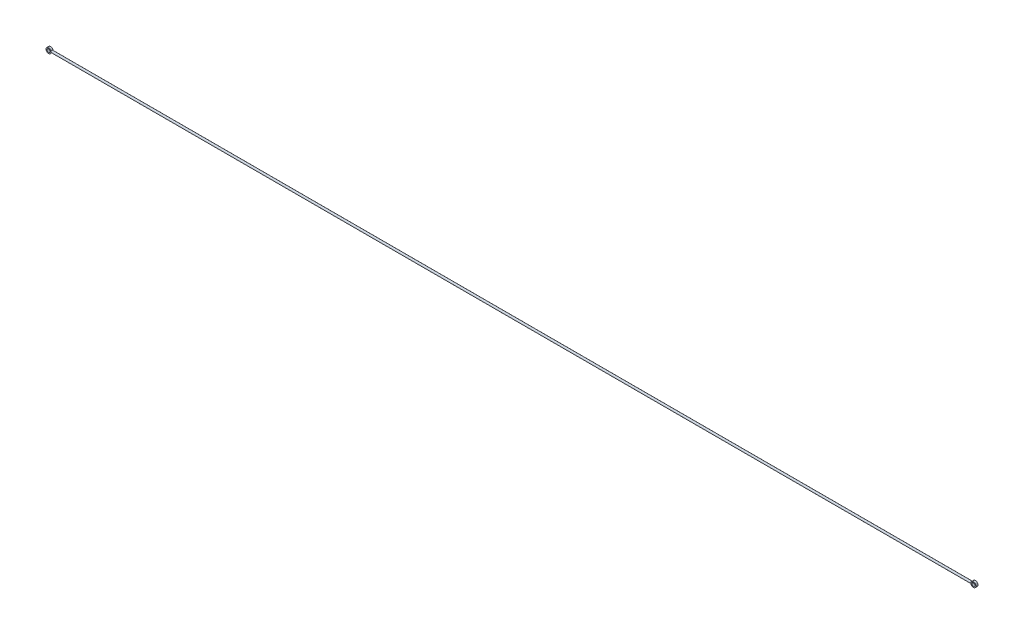
ISO-10303-21;
HEADER;
FILE_DESCRIPTION(('STEP AP214'),'2;1');
FILE_NAME('part.step','',(''),(''),'','','');
FILE_SCHEMA(('AUTOMOTIVE_DESIGN { 1 0 10303 214 1 1 1 1 }'));
ENDSEC;
DATA;
#1=APPLICATION_CONTEXT('core data for automotive mechanical design processes');
#2=APPLICATION_PROTOCOL_DEFINITION('international standard','automotive_design',2000,#1);
#3=PRODUCT_CONTEXT('',#1,'mechanical');
#4=PRODUCT('Part','Part','',(#3));
#5=PRODUCT_RELATED_PRODUCT_CATEGORY('part','',(#4));
#6=PRODUCT_DEFINITION_FORMATION('','',#4);
#7=PRODUCT_DEFINITION_CONTEXT('part definition',#1,'design');
#8=PRODUCT_DEFINITION('design','',#6,#7);
#9=PRODUCT_DEFINITION_SHAPE('','',#8);
#10=(LENGTH_UNIT() NAMED_UNIT(*) SI_UNIT(.MILLI.,.METRE.));
#11=(NAMED_UNIT(*) PLANE_ANGLE_UNIT() SI_UNIT($,.RADIAN.));
#12=(NAMED_UNIT(*) SI_UNIT($,.STERADIAN.) SOLID_ANGLE_UNIT());
#13=UNCERTAINTY_MEASURE_WITH_UNIT(LENGTH_MEASURE(1.E-05),#10,'distance_accuracy_value','');
#14=(GEOMETRIC_REPRESENTATION_CONTEXT(3) GLOBAL_UNCERTAINTY_ASSIGNED_CONTEXT((#13)) GLOBAL_UNIT_ASSIGNED_CONTEXT((#10,
#11,#12)) REPRESENTATION_CONTEXT('',''));
#15=CARTESIAN_POINT('',(0.,0.,0.));
#16=DIRECTION('',(0.,0.,1.));
#17=DIRECTION('',(1.,0.,0.));
#18=AXIS2_PLACEMENT_3D('',#15,#16,#17);
#19=CARTESIAN_POINT('',(1.,0.,-0.5));
#20=DIRECTION('',(0.,0.,1.));
#21=DIRECTION('',(1.,0.,0.));
#22=AXIS2_PLACEMENT_3D('',#19,#20,#21);
#23=CYLINDRICAL_SURFACE('',#22,1.25);
#24=CARTESIAN_POINT('',(-0.14564392373896,-0.5,0.));
#25=CARTESIAN_POINT('',(-0.145646629141054,-0.499997063550947,0.0267848745249728));
#26=CARTESIAN_POINT('',(-0.146596506210663,-0.497834954648588,0.053607633676176));
#27=CARTESIAN_POINT('',(-0.150277285469612,-0.489267257648183,0.106483708219267));
#28=CARTESIAN_POINT('',(-0.153012738467129,-0.482850826110533,0.132534879270122));
#29=CARTESIAN_POINT('',(-0.159901139478241,-0.466058758142176,0.183013235492513));
#30=CARTESIAN_POINT('',(-0.164048740892787,-0.455698038131356,0.207446136840064));
#31=CARTESIAN_POINT('',(-0.173286662738201,-0.431355067342903,0.254221262714904));
#32=CARTESIAN_POINT('',(-0.178376777259808,-0.417373607316875,0.276563942287715));
#33=CARTESIAN_POINT('',(-0.189252162627582,-0.385330493646855,0.319815100560363));
#34=CARTESIAN_POINT('',(-0.195059794896865,-0.367094839431832,0.340589105732367));
#35=CARTESIAN_POINT('',(-0.206531142447027,-0.327427276443511,0.378882249328843));
#36=CARTESIAN_POINT('',(-0.21219480684093,-0.30599425541892,0.396400250322465));
#37=CARTESIAN_POINT('',(-0.223008519767136,-0.259501577589095,0.428351599245676));
#38=CARTESIAN_POINT('',(-0.228129509208921,-0.234332241403071,0.442636075367661));
#39=CARTESIAN_POINT('',(-0.237009819078867,-0.18170633071878,0.466710892097452));
#40=CARTESIAN_POINT('',(-0.240769693461684,-0.154250692321991,0.476503061445488));
#41=CARTESIAN_POINT('',(-0.246345812520712,-0.0992416067097231,0.49083537160935));
#42=CARTESIAN_POINT('',(-0.248247341938392,-0.0717572462011515,0.495606828522255));
#43=CARTESIAN_POINT('',(-0.250200776706758,-0.0163165821594129,0.500507121415673));
#44=CARTESIAN_POINT('',(-0.250253371923282,0.0116395414563506,0.500637688983711));
#45=CARTESIAN_POINT('',(-0.248554907054464,0.0655581236788278,0.496379307556254));
#46=CARTESIAN_POINT('',(-0.24690499192959,0.0915443632185082,0.492243806813267));
#47=CARTESIAN_POINT('',(-0.242123228671976,0.142418277304584,0.480001780922311));
#48=CARTESIAN_POINT('',(-0.238991271802781,0.167305871097539,0.471894964399903));
#49=CARTESIAN_POINT('',(-0.231492061144249,0.215724484627914,0.451840879280924));
#50=CARTESIAN_POINT('',(-0.227106901167,0.239229405844908,0.439837571296117));
#51=CARTESIAN_POINT('',(-0.217536462949245,0.283952037685144,0.412383748270247));
#52=CARTESIAN_POINT('',(-0.212350910662685,0.305168960679027,0.396932051725594));
#53=CARTESIAN_POINT('',(-0.201304092945835,0.346192206998038,0.361837716013352));
#54=CARTESIAN_POINT('',(-0.1954208163006,0.36581446131841,0.341986526854042));
#55=CARTESIAN_POINT('',(-0.183904152411947,0.401526853846331,0.299252357044758));
#56=CARTESIAN_POINT('',(-0.178270847440867,0.417615835939914,0.276368387961459));
#57=CARTESIAN_POINT('',(-0.16774224360453,0.446226047185733,0.227395244397762));
#58=CARTESIAN_POINT('',(-0.162872285453452,0.458633662933726,0.201233792379046));
#59=CARTESIAN_POINT('',(-0.15471897616831,0.478794064991567,0.146946127384497));
#60=CARTESIAN_POINT('',(-0.151434594808349,0.4865498746011,0.118821203807288));
#61=CARTESIAN_POINT('',(-0.147074399181411,0.496738737207989,0.0632410556409874));
#62=CARTESIAN_POINT('',(-0.145875916120189,0.499468024202102,0.0358498882199586));
#63=CARTESIAN_POINT('',(-0.145473744692746,0.500390331612254,-0.0190193019419869));
#64=CARTESIAN_POINT('',(-0.146269451406158,0.498584727648221,-0.0464972958194602));
#65=CARTESIAN_POINT('',(-0.14964011089283,0.490758223697131,-0.0991147337387199));
#66=CARTESIAN_POINT('',(-0.152111144494424,0.484983265505864,-0.124298234349876));
#67=CARTESIAN_POINT('',(-0.158425127569679,0.469701046727819,-0.173322101196502));
#68=CARTESIAN_POINT('',(-0.162268381221859,0.460192958575598,-0.197162168276828));
#69=CARTESIAN_POINT('',(-0.171084454649875,0.437283909870363,-0.243900589448872));
#70=CARTESIAN_POINT('',(-0.176096761597837,0.423740717066149,-0.266721547173614));
#71=CARTESIAN_POINT('',(-0.186625962894593,0.393291306110469,-0.309870746860416));
#72=CARTESIAN_POINT('',(-0.192143062240157,0.376383718370496,-0.330197968198899));
#73=CARTESIAN_POINT('',(-0.203552289928493,0.338211052920121,-0.369343352149803));
#74=CARTESIAN_POINT('',(-0.209442018213006,0.316716357361274,-0.387939141322757));
#75=CARTESIAN_POINT('',(-0.220549486418907,0.270770908342211,-0.421294269152585));
#76=CARTESIAN_POINT('',(-0.2257671989831,0.246320034616966,-0.436053451649308));
#77=CARTESIAN_POINT('',(-0.234959289750713,0.19506998350044,-0.461261906615307));
#78=CARTESIAN_POINT('',(-0.238933965600684,0.168271370248516,-0.471712211041447));
#79=CARTESIAN_POINT('',(-0.245181783673225,0.113098397729806,-0.487887213101907));
#80=CARTESIAN_POINT('',(-0.247455849268859,0.0847249025735673,-0.493614475360017));
#81=CARTESIAN_POINT('',(-0.24994752052628,0.0292041275865757,-0.499876175406346));
#82=CARTESIAN_POINT('',(-0.250289616862183,0.00209762314826379,-0.500725032115662));
#83=CARTESIAN_POINT('',(-0.249215105946482,-0.0518584589333109,-0.498036130178974));
#84=CARTESIAN_POINT('',(-0.247798764917281,-0.0787080748486556,-0.494499035553595));
#85=CARTESIAN_POINT('',(-0.243428783410637,-0.130542725486603,-0.48336330291038));
#86=CARTESIAN_POINT('',(-0.240523701585826,-0.155559701162097,-0.475892763481111));
#87=CARTESIAN_POINT('',(-0.233487369580093,-0.203980588689735,-0.457236798859544));
#88=CARTESIAN_POINT('',(-0.229355893260029,-0.227384202066819,-0.446050688494914));
#89=CARTESIAN_POINT('',(-0.220045235900145,-0.273050760464029,-0.419724200377664));
#90=CARTESIAN_POINT('',(-0.214827824320576,-0.295217596701606,-0.404430926278729));
#91=CARTESIAN_POINT('',(-0.203973507966119,-0.336763507131018,-0.370552870205266));
#92=CARTESIAN_POINT('',(-0.198336430126252,-0.356141421436439,-0.351966725884971));
#93=CARTESIAN_POINT('',(-0.186844408898556,-0.392800316271498,-0.310671193868738));
#94=CARTESIAN_POINT('',(-0.180997581513459,-0.409877221799757,-0.287777781649723));
#95=CARTESIAN_POINT('',(-0.17012417868795,-0.439961862609849,-0.239264465642808));
#96=CARTESIAN_POINT('',(-0.165097699718638,-0.452969119474997,-0.213644241772536));
#97=CARTESIAN_POINT('',(-0.15689716114477,-0.473497771918328,-0.162740699537982));
#98=CARTESIAN_POINT('',(-0.153597296529121,-0.481406878541052,-0.137633691312206));
#99=CARTESIAN_POINT('',(-0.14861500900991,-0.493179439454596,-0.0863786450924146));
#100=CARTESIAN_POINT('',(-0.146928080180438,-0.497054166972004,-0.0602337210082595));
#101=CARTESIAN_POINT('',(-0.145811146894087,-0.499616064577543,-0.0226556094155181));
#102=CARTESIAN_POINT('',(-0.145642779233393,-0.50000124224872,-0.0113311947505995));
#103=CARTESIAN_POINT('',(-0.14564392373896,-0.5,0.));
#104=B_SPLINE_CURVE_WITH_KNOTS('',3,(#24,#25,#26,#27,#28,#29,#30,#31,#32,#33,#34,#35,#36,#37,
#38,#39,#40,#41,#42,#43,#44,#45,#46,#47,#48,#49,#50,#51,#52,#53,#54,#55,#56,#57,#58,#59,#60,#61,
#62,#63,#64,#65,#66,#67,#68,#69,#70,#71,#72,#73,#74,#75,#76,#77,#78,#79,#80,#81,#82,#83,#84,#85,
#86,#87,#88,#89,#90,#91,#92,#93,#94,#95,#96,#97,#98,#99,#100,#101,#102,#103),.UNSPECIFIED.,.T.,
.F.,(4,2,2,2,2,2,2,2,2,2,2,2,2,2,2,2,2,2,2,2,2,2,2,2,2,2,2,2,2,2,2,2,2,2,2,2,2,2,2,4),(0.,
0.0803194121919135,0.160844333955561,0.241067705823347,0.321273572059654,0.405639045711062,
0.490033935870855,0.577756672728571,0.665443667423701,0.748885457217959,0.83229611326418,
0.911021612075756,0.989752887822649,1.06967075058725,1.14961603735008,1.23481011020339,
1.32003201781782,1.40766114678644,1.49523326198528,1.57745536879608,1.65965253725487,
1.73716812019789,1.81470089661412,1.89537788661678,1.97608778629965,2.06275933560247,
2.14943441211689,2.23608871826706,2.32269593987037,2.40365259937491,2.48459700376653,
2.56305498609341,2.64152744455649,2.72346762783484,2.80544179139554,2.89249063319906,
2.979549704383,3.05879165203272,3.13781157553314,3.17179026380183),.UNSPECIFIED.);
#105=CARTESIAN_POINT('',(-0.25,0.,0.5));
#106=VERTEX_POINT('',#105);
#107=CARTESIAN_POINT('',(-0.25,0.,-0.5));
#108=VERTEX_POINT('',#107);
#109=EDGE_CURVE('E74',#106,#108,#104,.T.);
#110=ORIENTED_EDGE('',*,*,#109,.F.);
#111=CARTESIAN_POINT('',(1.,0.,0.5));
#112=DIRECTION('',(0.,0.,1.));
#113=DIRECTION('',(1.,0.,0.));
#114=AXIS2_PLACEMENT_3D('',#111,#112,#113);
#115=CIRCLE('',#114,1.25);
#116=EDGE_CURVE('E61',#106,#106,#115,.T.);
#117=ORIENTED_EDGE('',*,*,#116,.F.);
#118=EDGE_CURVE('E96',#108,#106,#104,.T.);
#119=ORIENTED_EDGE('',*,*,#118,.F.);
#120=CARTESIAN_POINT('',(1.,0.,-0.5));
#121=DIRECTION('',(0.,0.,1.));
#122=DIRECTION('',(1.,0.,0.));
#123=AXIS2_PLACEMENT_3D('',#120,#121,#122);
#124=CIRCLE('',#123,1.25);
#125=EDGE_CURVE('E94',#108,#108,#124,.T.);
#126=ORIENTED_EDGE('',*,*,#125,.T.);
#127=EDGE_LOOP('',(#110,#117,#119,#126));
#128=FACE_BOUND('',#127,.T.);
#129=ADVANCED_FACE('F36',(#128),#23,.T.);
#130=CARTESIAN_POINT('',(1.,0.,-0.5));
#131=DIRECTION('',(0.,0.,1.));
#132=DIRECTION('',(1.,0.,0.));
#133=AXIS2_PLACEMENT_3D('',#130,#131,#132);
#134=PLANE('',#133);
#135=ORIENTED_EDGE('',*,*,#125,.F.);
#136=EDGE_LOOP('',(#135));
#137=FACE_BOUND('',#136,.T.);
#138=CARTESIAN_POINT('',(1.,0.,-0.5));
#139=DIRECTION('',(0.,0.,1.));
#140=DIRECTION('',(1.,0.,0.));
#141=AXIS2_PLACEMENT_3D('',#138,#139,#140);
#142=CIRCLE('',#141,0.75);
#143=CARTESIAN_POINT('',(1.75,0.,-0.5));
#144=VERTEX_POINT('',#143);
#145=EDGE_CURVE('E91',#144,#144,#142,.T.);
#146=ORIENTED_EDGE('',*,*,#145,.T.);
#147=EDGE_LOOP('',(#146));
#148=FACE_BOUND('',#147,.T.);
#149=ADVANCED_FACE('F104',(#137,#148),#134,.F.);
#150=CARTESIAN_POINT('',(1.,0.,-0.5));
#151=DIRECTION('',(0.,0.,1.));
#152=DIRECTION('',(1.,0.,0.));
#153=AXIS2_PLACEMENT_3D('',#150,#151,#152);
#154=CYLINDRICAL_SURFACE('',#153,0.75);
#155=ORIENTED_EDGE('',*,*,#145,.F.);
#156=EDGE_LOOP('',(#155));
#157=FACE_BOUND('',#156,.T.);
#158=CARTESIAN_POINT('',(1.,0.,0.5));
#159=DIRECTION('',(0.,0.,1.));
#160=DIRECTION('',(1.,0.,0.));
#161=AXIS2_PLACEMENT_3D('',#158,#159,#160);
#162=CIRCLE('',#161,0.75);
#163=CARTESIAN_POINT('',(1.75,0.,0.5));
#164=VERTEX_POINT('',#163);
#165=EDGE_CURVE('E87',#164,#164,#162,.T.);
#166=ORIENTED_EDGE('',*,*,#165,.T.);
#167=EDGE_LOOP('',(#166));
#168=FACE_BOUND('',#167,.T.);
#169=ADVANCED_FACE('F107',(#157,#168),#154,.F.);
#170=CARTESIAN_POINT('',(1.,0.,0.5));
#171=DIRECTION('',(0.,0.,1.));
#172=DIRECTION('',(1.,0.,0.));
#173=AXIS2_PLACEMENT_3D('',#170,#171,#172);
#174=PLANE('',#173);
#175=ORIENTED_EDGE('',*,*,#116,.T.);
#176=EDGE_LOOP('',(#175));
#177=FACE_BOUND('',#176,.T.);
#178=ORIENTED_EDGE('',*,*,#165,.F.);
#179=EDGE_LOOP('',(#178));
#180=FACE_BOUND('',#179,.T.);
#181=ADVANCED_FACE('F111',(#177,#180),#174,.T.);
#182=CARTESIAN_POINT('',(0.,0.,0.));
#183=DIRECTION('',(-1.,0.,0.));
#184=DIRECTION('',(0.,-1.,0.));
#185=AXIS2_PLACEMENT_3D('',#182,#183,#184);
#186=CYLINDRICAL_SURFACE('',#185,0.5);
#187=CARTESIAN_POINT('',(-449.854356076261,-0.500000000000055,0.));
#188=CARTESIAN_POINT('',(-449.854353370859,-0.499997063551002,-0.0267848745249707));
#189=CARTESIAN_POINT('',(-449.853403493789,-0.497834954648644,-0.0536076336761722));
#190=CARTESIAN_POINT('',(-449.84972271453,-0.489267257648239,-0.106483708219263));
#191=CARTESIAN_POINT('',(-449.846987261533,-0.482850826110588,-0.132534879270119));
#192=CARTESIAN_POINT('',(-449.840098860522,-0.466058758142232,-0.18301323549251));
#193=CARTESIAN_POINT('',(-449.835951259107,-0.455698038131413,-0.207446136840059));
#194=CARTESIAN_POINT('',(-449.826713337262,-0.43135506734296,-0.2542212627149));
#195=CARTESIAN_POINT('',(-449.82162322274,-0.417373607316931,-0.276563942287713));
#196=CARTESIAN_POINT('',(-449.810747837372,-0.385330493646911,-0.319815100560362));
#197=CARTESIAN_POINT('',(-449.804940205103,-0.367094839431889,-0.340589105732365));
#198=CARTESIAN_POINT('',(-449.793468857553,-0.32742727644357,-0.37888224932884));
#199=CARTESIAN_POINT('',(-449.787805193159,-0.305994255418979,-0.396400250322461));
#200=CARTESIAN_POINT('',(-449.776991480233,-0.259501577589156,-0.428351599245672));
#201=CARTESIAN_POINT('',(-449.771870490791,-0.234332241403134,-0.442636075367657));
#202=CARTESIAN_POINT('',(-449.762990180921,-0.181706330718845,-0.466710892097448));
#203=CARTESIAN_POINT('',(-449.759230306538,-0.154250692322054,-0.476503061445485));
#204=CARTESIAN_POINT('',(-449.753654187479,-0.0992416067097857,-0.490835371609349));
#205=CARTESIAN_POINT('',(-449.751752658062,-0.0717572462012147,-0.495606828522254));
#206=CARTESIAN_POINT('',(-449.749799223293,-0.0163165821594747,-0.500507121415673));
#207=CARTESIAN_POINT('',(-449.749746628077,0.0116395414562908,-0.500637688983711));
#208=CARTESIAN_POINT('',(-449.751445092946,0.0655581236787677,-0.496379307556254));
#209=CARTESIAN_POINT('',(-449.75309500807,0.0915443632184458,-0.492243806813269));
#210=CARTESIAN_POINT('',(-449.757876771328,0.142418277304523,-0.480001780922313));
#211=CARTESIAN_POINT('',(-449.761008728197,0.167305871097481,-0.471894964399904));
#212=CARTESIAN_POINT('',(-449.768507938856,0.215724484627859,-0.451840879280924));
#213=CARTESIAN_POINT('',(-449.772893098833,0.239229405844854,-0.439837571296116));
#214=CARTESIAN_POINT('',(-449.782463537051,0.283952037685087,-0.412383748270248));
#215=CARTESIAN_POINT('',(-449.787649089337,0.305168960678968,-0.396932051725598));
#216=CARTESIAN_POINT('',(-449.798695907054,0.346192206997977,-0.361837716013357));
#217=CARTESIAN_POINT('',(-449.804579183699,0.365814461318351,-0.341986526854046));
#218=CARTESIAN_POINT('',(-449.816095847588,0.401526853846272,-0.299252357044766));
#219=CARTESIAN_POINT('',(-449.821729152559,0.417615835939852,-0.27636838796147));
#220=CARTESIAN_POINT('',(-449.832257756395,0.446226047185672,-0.227395244397772));
#221=CARTESIAN_POINT('',(-449.837127714546,0.458633662933669,-0.201233792379049));
#222=CARTESIAN_POINT('',(-449.845281023832,0.478794064991511,-0.146946127384499));
#223=CARTESIAN_POINT('',(-449.848565405192,0.486549874601043,-0.118821203807294));
#224=CARTESIAN_POINT('',(-449.852925600819,0.496738737207933,-0.0632410556409962));
#225=CARTESIAN_POINT('',(-449.85412408388,0.499468024202047,-0.0358498882199669));
#226=CARTESIAN_POINT('',(-449.854526255307,0.5003903316122,0.0190193019419787));
#227=CARTESIAN_POINT('',(-449.853730548594,0.498584727648166,0.0464972958194517));
#228=CARTESIAN_POINT('',(-449.850359889107,0.490758223697078,0.0991147337387118));
#229=CARTESIAN_POINT('',(-449.847888855506,0.484983265505811,0.124298234349869));
#230=CARTESIAN_POINT('',(-449.84157487243,0.469701046727766,0.173322101196497));
#231=CARTESIAN_POINT('',(-449.837731618778,0.460192958575545,0.197162168276824));
#232=CARTESIAN_POINT('',(-449.82891554535,0.437283909870308,0.243900589448873));
#233=CARTESIAN_POINT('',(-449.823903238402,0.423740717066091,0.266721547173618));
#234=CARTESIAN_POINT('',(-449.813374037105,0.393291306110409,0.309870746860422));
#235=CARTESIAN_POINT('',(-449.80785693776,0.376383718370436,0.330197968198904));
#236=CARTESIAN_POINT('',(-449.796447710072,0.338211052920067,0.369343352149801));
#237=CARTESIAN_POINT('',(-449.790557981787,0.316716357361227,0.387939141322751));
#238=CARTESIAN_POINT('',(-449.779450513581,0.270770908342166,0.421294269152579));
#239=CARTESIAN_POINT('',(-449.774232801017,0.246320034616915,0.436053451649306));
#240=CARTESIAN_POINT('',(-449.765040710249,0.195069983500387,0.461261906615306));
#241=CARTESIAN_POINT('',(-449.761066034399,0.168271370248467,0.471712211041445));
#242=CARTESIAN_POINT('',(-449.754818216327,0.113098397729762,0.487887213101905));
#243=CARTESIAN_POINT('',(-449.752544150731,0.0847249025735245,0.493614475360014));
#244=CARTESIAN_POINT('',(-449.750052479474,0.0292041275865335,0.499876175406346));
#245=CARTESIAN_POINT('',(-449.749710383138,0.00209762314822078,0.500725032115663));
#246=CARTESIAN_POINT('',(-449.750784894054,-0.0518584589333554,0.498036130178975));
#247=CARTESIAN_POINT('',(-449.752201235083,-0.0787080748487007,0.494499035553597));
#248=CARTESIAN_POINT('',(-449.756571216589,-0.130542725486652,0.483363302910382));
#249=CARTESIAN_POINT('',(-449.759476298414,-0.155559701162149,0.475892763481112));
#250=CARTESIAN_POINT('',(-449.76651263042,-0.203980588689791,0.457236798859543));
#251=CARTESIAN_POINT('',(-449.77064410674,-0.227384202066876,0.446050688494913));
#252=CARTESIAN_POINT('',(-449.7799547641,-0.273050760464083,0.419724200377665));
#253=CARTESIAN_POINT('',(-449.785172175679,-0.295217596701658,0.404430926278732));
#254=CARTESIAN_POINT('',(-449.796026492034,-0.336763507131066,0.370552870205272));
#255=CARTESIAN_POINT('',(-449.801663569874,-0.356141421436488,0.351966725884978));
#256=CARTESIAN_POINT('',(-449.813155591101,-0.392800316271548,0.310671193868743));
#257=CARTESIAN_POINT('',(-449.819002418487,-0.409877221799809,0.287777781649727));
#258=CARTESIAN_POINT('',(-449.829875821312,-0.439961862609901,0.239264465642813));
#259=CARTESIAN_POINT('',(-449.834902300281,-0.452969119475047,0.213644241772546));
#260=CARTESIAN_POINT('',(-449.843102838855,-0.473497771918377,0.162740699537998));
#261=CARTESIAN_POINT('',(-449.846402703471,-0.481406878541102,0.137633691312223));
#262=CARTESIAN_POINT('',(-449.85138499099,-0.493179439454648,0.0863786450924337));
#263=CARTESIAN_POINT('',(-449.85307191982,-0.497054166972056,0.06023372100828));
#264=CARTESIAN_POINT('',(-449.854188853106,-0.499616064577598,0.0226556094155331));
#265=CARTESIAN_POINT('',(-449.854357220767,-0.500001242248775,0.0113311947506071));
#266=CARTESIAN_POINT('',(-449.854356076261,-0.500000000000055,0.));
#267=B_SPLINE_CURVE_WITH_KNOTS('',3,(#187,#188,#189,#190,#191,#192,#193,#194,#195,#196,#197,
#198,#199,#200,#201,#202,#203,#204,#205,#206,#207,#208,#209,#210,#211,#212,#213,#214,#215,#216,
#217,#218,#219,#220,#221,#222,#223,#224,#225,#226,#227,#228,#229,#230,#231,#232,#233,#234,#235,
#236,#237,#238,#239,#240,#241,#242,#243,#244,#245,#246,#247,#248,#249,#250,#251,#252,#253,#254,
#255,#256,#257,#258,#259,#260,#261,#262,#263,#264,#265,#266),.UNSPECIFIED.,.T.,.F.,(4,2,2,2,2,2,
2,2,2,2,2,2,2,2,2,2,2,2,2,2,2,2,2,2,2,2,2,2,2,2,2,2,2,2,2,2,2,2,2,4),(0.,0.0803194121919077,
0.160844333955559,0.241067705823344,0.321273572059656,0.405639045711066,0.490033935870856,
0.577756672728567,0.665443667423693,0.748885457217958,0.832296113264183,0.911021612075752,
0.989752887822648,1.06967075058725,1.14961603735008,1.23481011020338,1.32003201781781,
1.40766114678644,1.49523326198528,1.57745536879607,1.65965253725487,1.73716812019789,
1.81470089661412,1.89537788661679,1.97608778629966,2.06275933560246,2.14943441211689,
2.23608871826705,2.32269593987035,2.4036525993749,2.48459700376652,2.56305498609341,
2.64152744455649,2.72346762783484,2.80544179139554,2.89249063319906,2.97954970438299,
3.0587916520327,3.13781157553312,3.17179026380184),.UNSPECIFIED.);
#268=CARTESIAN_POINT('',(-449.75,0.,0.5));
#269=VERTEX_POINT('',#268);
#270=CARTESIAN_POINT('',(-449.75,0.,-0.500000000000257));
#271=VERTEX_POINT('',#270);
#272=EDGE_CURVE('E41',#269,#271,#267,.T.);
#273=ORIENTED_EDGE('',*,*,#272,.T.);
#274=EDGE_CURVE('E11',#271,#269,#267,.T.);
#275=ORIENTED_EDGE('',*,*,#274,.T.);
#276=EDGE_LOOP('',(#273,#275));
#277=FACE_BOUND('',#276,.T.);
#278=ORIENTED_EDGE('',*,*,#118,.T.);
#279=ORIENTED_EDGE('',*,*,#109,.T.);
#280=EDGE_LOOP('',(#278,#279));
#281=FACE_BOUND('',#280,.T.);
#282=ADVANCED_FACE('F38',(#277,#281),#186,.T.);
#283=CARTESIAN_POINT('',(-451.,0.,-0.5));
#284=DIRECTION('',(0.,0.,1.));
#285=DIRECTION('',(1.,0.,0.));
#286=AXIS2_PLACEMENT_3D('',#283,#284,#285);
#287=CYLINDRICAL_SURFACE('',#286,1.25000000000001);
#288=ORIENTED_EDGE('',*,*,#274,.F.);
#289=CARTESIAN_POINT('',(-451.,0.,-0.5));
#290=DIRECTION('',(0.,0.,1.));
#291=DIRECTION('',(1.,0.,0.));
#292=AXIS2_PLACEMENT_3D('',#289,#290,#291);
#293=CIRCLE('',#292,1.25000000000001);
#294=EDGE_CURVE('E54',#271,#271,#293,.T.);
#295=ORIENTED_EDGE('',*,*,#294,.T.);
#296=ORIENTED_EDGE('',*,*,#272,.F.);
#297=CARTESIAN_POINT('',(-451.,0.,0.5));
#298=DIRECTION('',(0.,0.,1.));
#299=DIRECTION('',(1.,0.,0.));
#300=AXIS2_PLACEMENT_3D('',#297,#298,#299);
#301=CIRCLE('',#300,1.25000000000001);
#302=EDGE_CURVE('E72',#269,#269,#301,.T.);
#303=ORIENTED_EDGE('',*,*,#302,.F.);
#304=EDGE_LOOP('',(#288,#295,#296,#303));
#305=FACE_BOUND('',#304,.T.);
#306=ADVANCED_FACE('F71',(#305),#287,.T.);
#307=CARTESIAN_POINT('',(-451.,0.,-0.5));
#308=DIRECTION('',(0.,0.,1.));
#309=DIRECTION('',(1.,0.,0.));
#310=AXIS2_PLACEMENT_3D('',#307,#308,#309);
#311=PLANE('',#310);
#312=CARTESIAN_POINT('',(-451.,0.,-0.5));
#313=DIRECTION('',(0.,0.,1.));
#314=DIRECTION('',(1.,0.,0.));
#315=AXIS2_PLACEMENT_3D('',#312,#313,#314);
#316=CIRCLE('',#315,0.750000000000041);
#317=CARTESIAN_POINT('',(-450.25,0.,-0.5));
#318=VERTEX_POINT('',#317);
#319=EDGE_CURVE('E78',#318,#318,#316,.T.);
#320=ORIENTED_EDGE('',*,*,#319,.T.);
#321=EDGE_LOOP('',(#320));
#322=FACE_BOUND('',#321,.T.);
#323=ORIENTED_EDGE('',*,*,#294,.F.);
#324=EDGE_LOOP('',(#323));
#325=FACE_BOUND('',#324,.T.);
#326=ADVANCED_FACE('F118',(#322,#325),#311,.F.);
#327=CARTESIAN_POINT('',(-451.,0.,-0.5));
#328=DIRECTION('',(0.,0.,1.));
#329=DIRECTION('',(1.,0.,0.));
#330=AXIS2_PLACEMENT_3D('',#327,#328,#329);
#331=CYLINDRICAL_SURFACE('',#330,0.750000000000041);
#332=ORIENTED_EDGE('',*,*,#319,.F.);
#333=EDGE_LOOP('',(#332));
#334=FACE_BOUND('',#333,.T.);
#335=CARTESIAN_POINT('',(-451.,0.,0.5));
#336=DIRECTION('',(0.,0.,1.));
#337=DIRECTION('',(1.,0.,0.));
#338=AXIS2_PLACEMENT_3D('',#335,#336,#337);
#339=CIRCLE('',#338,0.750000000000041);
#340=CARTESIAN_POINT('',(-450.25,0.,0.5));
#341=VERTEX_POINT('',#340);
#342=EDGE_CURVE('E79',#341,#341,#339,.T.);
#343=ORIENTED_EDGE('',*,*,#342,.T.);
#344=EDGE_LOOP('',(#343));
#345=FACE_BOUND('',#344,.T.);
#346=ADVANCED_FACE('F121',(#334,#345),#331,.F.);
#347=CARTESIAN_POINT('',(-451.,0.,0.5));
#348=DIRECTION('',(0.,0.,1.));
#349=DIRECTION('',(1.,0.,0.));
#350=AXIS2_PLACEMENT_3D('',#347,#348,#349);
#351=PLANE('',#350);
#352=ORIENTED_EDGE('',*,*,#302,.T.);
#353=EDGE_LOOP('',(#352));
#354=FACE_BOUND('',#353,.T.);
#355=ORIENTED_EDGE('',*,*,#342,.F.);
#356=EDGE_LOOP('',(#355));
#357=FACE_BOUND('',#356,.T.);
#358=ADVANCED_FACE('F76',(#354,#357),#351,.T.);
#359=CLOSED_SHELL('',(#129,#149,#169,#181,#282,#306,#326,#346,#358));
#360=MANIFOLD_SOLID_BREP('B2',#359);
#361=ADVANCED_BREP_SHAPE_REPRESENTATION('',(#18,#360),#14);
#362=SHAPE_DEFINITION_REPRESENTATION(#9,#361);
ENDSEC;
END-ISO-10303-21;
